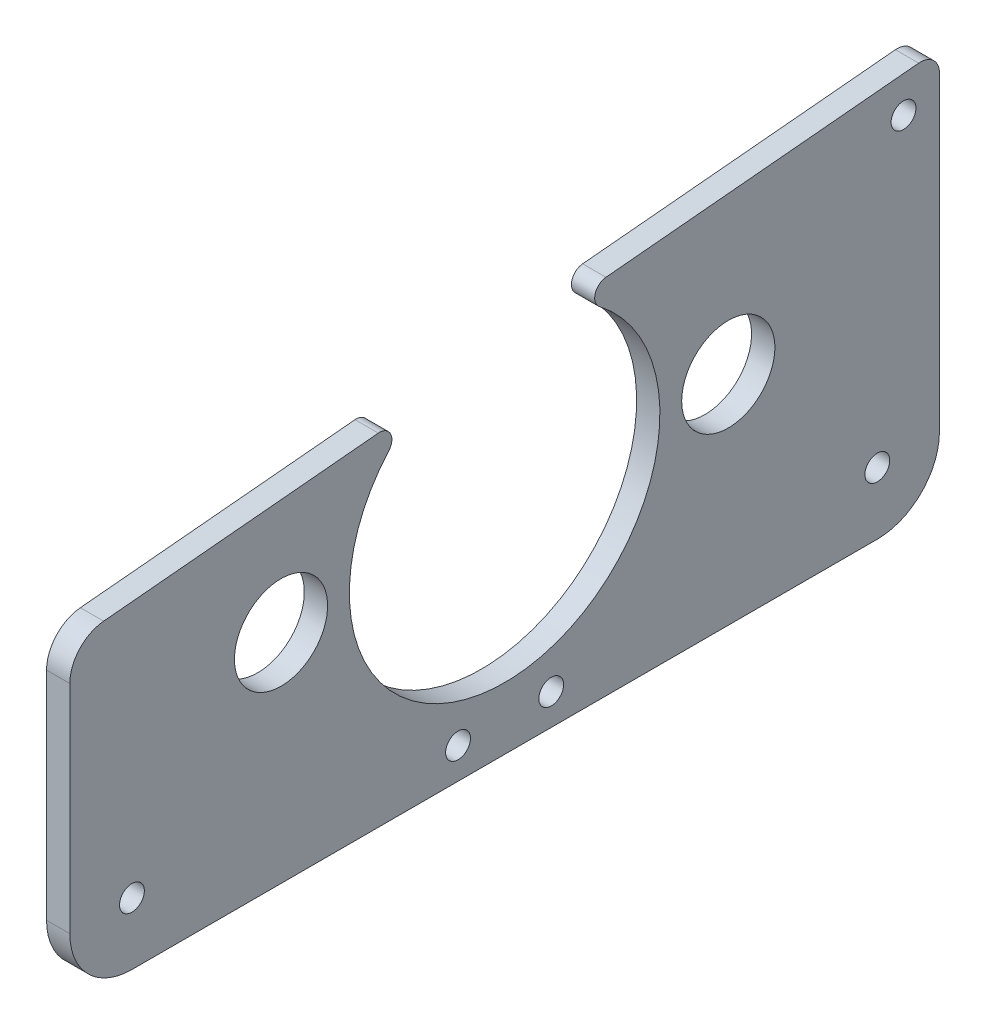
ISO-10303-21;
HEADER;
FILE_DESCRIPTION(('STEP AP214'),'2;1');
FILE_NAME('part.step','',(''),(''),'','','');
FILE_SCHEMA(('AUTOMOTIVE_DESIGN { 1 0 10303 214 1 1 1 1 }'));
ENDSEC;
DATA;
#1=APPLICATION_CONTEXT('core data for automotive mechanical design processes');
#2=APPLICATION_PROTOCOL_DEFINITION('international standard','automotive_design',2000,#1);
#3=PRODUCT_CONTEXT('',#1,'mechanical');
#4=PRODUCT('Part','Part','',(#3));
#5=PRODUCT_RELATED_PRODUCT_CATEGORY('part','',(#4));
#6=PRODUCT_DEFINITION_FORMATION('','',#4);
#7=PRODUCT_DEFINITION_CONTEXT('part definition',#1,'design');
#8=PRODUCT_DEFINITION('design','',#6,#7);
#9=PRODUCT_DEFINITION_SHAPE('','',#8);
#10=(LENGTH_UNIT() NAMED_UNIT(*) SI_UNIT(.MILLI.,.METRE.));
#11=(NAMED_UNIT(*) PLANE_ANGLE_UNIT() SI_UNIT($,.RADIAN.));
#12=(NAMED_UNIT(*) SI_UNIT($,.STERADIAN.) SOLID_ANGLE_UNIT());
#13=UNCERTAINTY_MEASURE_WITH_UNIT(LENGTH_MEASURE(1.E-05),#10,'distance_accuracy_value','');
#14=(GEOMETRIC_REPRESENTATION_CONTEXT(3) GLOBAL_UNCERTAINTY_ASSIGNED_CONTEXT((#13)) GLOBAL_UNIT_ASSIGNED_CONTEXT((#10,
#11,#12)) REPRESENTATION_CONTEXT('',''));
#15=CARTESIAN_POINT('',(0.,0.,0.));
#16=DIRECTION('',(0.,0.,1.));
#17=DIRECTION('',(1.,0.,0.));
#18=AXIS2_PLACEMENT_3D('',#15,#16,#17);
#19=CARTESIAN_POINT('',(4.7625,43.2742885665233,519.572478048036));
#20=DIRECTION('',(1.,0.,0.));
#21=DIRECTION('',(0.,0.,1.));
#22=AXIS2_PLACEMENT_3D('',#19,#20,#21);
#23=CYLINDRICAL_SURFACE('',#22,12.7);
#24=DIRECTION('',(1.,0.,0.));
#25=VECTOR('',#24,1.);
#26=CARTESIAN_POINT('',(4.7625,43.2742885665234,506.872478048036));
#27=LINE('',#26,#25);
#28=CARTESIAN_POINT('',(0.,43.2742885665234,506.872478048036));
#29=VERTEX_POINT('',#28);
#30=CARTESIAN_POINT('',(4.7625,43.2742885665234,506.872478048036));
#31=VERTEX_POINT('',#30);
#32=EDGE_CURVE('E251',#29,#31,#27,.T.);
#33=ORIENTED_EDGE('',*,*,#32,.T.);
#34=CARTESIAN_POINT('',(4.7625,43.2742885665233,519.572478048036));
#35=DIRECTION('',(-1.,0.,0.));
#36=DIRECTION('',(0.,0.,1.));
#37=AXIS2_PLACEMENT_3D('',#34,#35,#36);
#38=CIRCLE('',#37,12.7);
#39=CARTESIAN_POINT('',(4.7625,30.5742885665233,519.572478048036));
#40=VERTEX_POINT('',#39);
#41=EDGE_CURVE('E132',#31,#40,#38,.T.);
#42=ORIENTED_EDGE('',*,*,#41,.T.);
#43=DIRECTION('',(1.,0.,0.));
#44=VECTOR('',#43,1.);
#45=CARTESIAN_POINT('',(4.7625,30.5742885665233,519.572478048036));
#46=LINE('',#45,#44);
#47=CARTESIAN_POINT('',(0.,30.5742885665233,519.572478048036));
#48=VERTEX_POINT('',#47);
#49=EDGE_CURVE('E248',#48,#40,#46,.T.);
#50=ORIENTED_EDGE('',*,*,#49,.F.);
#51=CARTESIAN_POINT('',(0.,43.2742885665233,519.572478048036));
#52=DIRECTION('',(-1.,0.,0.));
#53=DIRECTION('',(0.,0.,1.));
#54=AXIS2_PLACEMENT_3D('',#51,#52,#53);
#55=CIRCLE('',#54,12.7);
#56=EDGE_CURVE('E219',#29,#48,#55,.T.);
#57=ORIENTED_EDGE('',*,*,#56,.F.);
#58=EDGE_LOOP('',(#33,#42,#50,#57));
#59=FACE_BOUND('',#58,.T.);
#60=ADVANCED_FACE('F37',(#59),#23,.T.);
#61=CARTESIAN_POINT('',(4.7625,30.5742885665233,671.972478048036));
#62=DIRECTION('',(0.,-1.,0.));
#63=DIRECTION('',(0.,0.,1.));
#64=AXIS2_PLACEMENT_3D('',#61,#62,#63);
#65=PLANE('',#64);
#66=ORIENTED_EDGE('',*,*,#49,.T.);
#67=DIRECTION('',(0.,0.,1.));
#68=VECTOR('',#67,1.);
#69=CARTESIAN_POINT('',(4.7625,30.5742885665233,671.972478048036));
#70=LINE('',#69,#68);
#71=CARTESIAN_POINT('',(4.7625,30.5742885665233,671.972478048036));
#72=VERTEX_POINT('',#71);
#73=EDGE_CURVE('E157',#40,#72,#70,.T.);
#74=ORIENTED_EDGE('',*,*,#73,.T.);
#75=DIRECTION('',(1.,0.,0.));
#76=VECTOR('',#75,1.);
#77=CARTESIAN_POINT('',(4.7625,30.5742885665233,671.972478048036));
#78=LINE('',#77,#76);
#79=CARTESIAN_POINT('',(0.,30.5742885665233,671.972478048036));
#80=VERTEX_POINT('',#79);
#81=EDGE_CURVE('E245',#80,#72,#78,.T.);
#82=ORIENTED_EDGE('',*,*,#81,.F.);
#83=DIRECTION('',(0.,0.,1.));
#84=VECTOR('',#83,1.);
#85=CARTESIAN_POINT('',(0.,30.5742885665233,510.75512339621));
#86=LINE('',#85,#84);
#87=EDGE_CURVE('E216',#48,#80,#86,.T.);
#88=ORIENTED_EDGE('',*,*,#87,.F.);
#89=EDGE_LOOP('',(#66,#74,#82,#88));
#90=FACE_BOUND('',#89,.T.);
#91=ADVANCED_FACE('F290',(#90),#65,.T.);
#92=CARTESIAN_POINT('',(4.7625,43.2742885665233,671.972478048036));
#93=DIRECTION('',(1.,0.,0.));
#94=DIRECTION('',(0.,0.,1.));
#95=AXIS2_PLACEMENT_3D('',#92,#93,#94);
#96=CYLINDRICAL_SURFACE('',#95,12.7);
#97=ORIENTED_EDGE('',*,*,#81,.T.);
#98=CARTESIAN_POINT('',(4.7625,43.2742885665233,671.972478048036));
#99=DIRECTION('',(-1.,0.,0.));
#100=DIRECTION('',(0.,0.,1.));
#101=AXIS2_PLACEMENT_3D('',#98,#99,#100);
#102=CIRCLE('',#101,12.7);
#103=CARTESIAN_POINT('',(4.7625,43.2742885665234,684.672478048036));
#104=VERTEX_POINT('',#103);
#105=EDGE_CURVE('E160',#72,#104,#102,.T.);
#106=ORIENTED_EDGE('',*,*,#105,.T.);
#107=DIRECTION('',(1.,0.,0.));
#108=VECTOR('',#107,1.);
#109=CARTESIAN_POINT('',(4.7625,43.2742885665234,684.672478048036));
#110=LINE('',#109,#108);
#111=CARTESIAN_POINT('',(0.,43.2742885665234,684.672478048036));
#112=VERTEX_POINT('',#111);
#113=EDGE_CURVE('E242',#112,#104,#110,.T.);
#114=ORIENTED_EDGE('',*,*,#113,.F.);
#115=CARTESIAN_POINT('',(0.,43.2742885665233,671.972478048036));
#116=DIRECTION('',(-1.,0.,0.));
#117=DIRECTION('',(0.,0.,1.));
#118=AXIS2_PLACEMENT_3D('',#115,#116,#117);
#119=CIRCLE('',#118,12.7);
#120=EDGE_CURVE('E213',#80,#112,#119,.T.);
#121=ORIENTED_EDGE('',*,*,#120,.F.);
#122=EDGE_LOOP('',(#97,#106,#114,#121));
#123=FACE_BOUND('',#122,.T.);
#124=ADVANCED_FACE('F294',(#123),#96,.T.);
#125=CARTESIAN_POINT('',(4.7625,87.5685067589977,684.672478048036));
#126=DIRECTION('',(0.,0.,1.));
#127=DIRECTION('',(0.,1.,0.));
#128=AXIS2_PLACEMENT_3D('',#125,#126,#127);
#129=PLANE('',#128);
#130=ORIENTED_EDGE('',*,*,#113,.T.);
#131=DIRECTION('',(0.,1.,0.));
#132=VECTOR('',#131,1.);
#133=CARTESIAN_POINT('',(4.7625,87.5685067589977,684.672478048036));
#134=LINE('',#133,#132);
#135=CARTESIAN_POINT('',(4.7625,87.5685067589977,684.672478048036));
#136=VERTEX_POINT('',#135);
#137=EDGE_CURVE('E163',#104,#136,#134,.T.);
#138=ORIENTED_EDGE('',*,*,#137,.T.);
#139=DIRECTION('',(1.,0.,0.));
#140=VECTOR('',#139,1.);
#141=CARTESIAN_POINT('',(4.7625,87.5685067589977,684.672478048036));
#142=LINE('',#141,#140);
#143=CARTESIAN_POINT('',(0.,87.5685067589977,684.672478048036));
#144=VERTEX_POINT('',#143);
#145=EDGE_CURVE('E239',#144,#136,#142,.T.);
#146=ORIENTED_EDGE('',*,*,#145,.F.);
#147=DIRECTION('',(0.,1.,0.));
#148=VECTOR('',#147,1.);
#149=CARTESIAN_POINT('',(0.,106.774288566523,684.672478048036));
#150=LINE('',#149,#148);
#151=EDGE_CURVE('E210',#112,#144,#150,.T.);
#152=ORIENTED_EDGE('',*,*,#151,.F.);
#153=EDGE_LOOP('',(#130,#138,#146,#152));
#154=FACE_BOUND('',#153,.T.);
#155=ADVANCED_FACE('F296',(#154),#129,.T.);
#156=CARTESIAN_POINT('',(4.7625,87.5685067589978,677.052478048036));
#157=DIRECTION('',(1.,0.,0.));
#158=DIRECTION('',(0.,0.,1.));
#159=AXIS2_PLACEMENT_3D('',#156,#157,#158);
#160=CYLINDRICAL_SURFACE('',#159,7.61999999999997);
#161=ORIENTED_EDGE('',*,*,#145,.T.);
#162=CARTESIAN_POINT('',(4.7625,87.5685067589978,677.052478048036));
#163=DIRECTION('',(-1.,0.,0.));
#164=DIRECTION('',(0.,0.,1.));
#165=AXIS2_PLACEMENT_3D('',#162,#163,#164);
#166=CIRCLE('',#165,7.61999999999997);
#167=CARTESIAN_POINT('',(4.7625,95.1558223329558,677.757490375002));
#168=VERTEX_POINT('',#167);
#169=EDGE_CURVE('E166',#136,#168,#166,.T.);
#170=ORIENTED_EDGE('',*,*,#169,.T.);
#171=DIRECTION('',(1.,0.,0.));
#172=VECTOR('',#171,1.);
#173=CARTESIAN_POINT('',(4.7625,95.1558223329558,677.757490375002));
#174=LINE('',#173,#172);
#175=CARTESIAN_POINT('',(0.,95.1558223329558,677.757490375002));
#176=VERTEX_POINT('',#175);
#177=EDGE_CURVE('E236',#176,#168,#174,.T.);
#178=ORIENTED_EDGE('',*,*,#177,.F.);
#179=CARTESIAN_POINT('',(0.,87.5685067589978,677.052478048036));
#180=DIRECTION('',(-1.,0.,0.));
#181=DIRECTION('',(0.,0.,1.));
#182=AXIS2_PLACEMENT_3D('',#179,#180,#181);
#183=CIRCLE('',#182,7.61999999999997);
#184=EDGE_CURVE('E207',#144,#176,#183,.T.);
#185=ORIENTED_EDGE('',*,*,#184,.F.);
#186=EDGE_LOOP('',(#161,#170,#178,#185));
#187=FACE_BOUND('',#186,.T.);
#188=ADVANCED_FACE('F277',(#187),#160,.T.);
#189=CARTESIAN_POINT('',(4.7625,101.089266083528,613.901996713408));
#190=DIRECTION('',(0.,0.995710705243837,0.0925213027514315));
#191=DIRECTION('',(0.,0.0925213027514315,-0.995710705243836));
#192=AXIS2_PLACEMENT_3D('',#189,#190,#191);
#193=PLANE('',#192);
#194=DIRECTION('',(0.,0.0925213027514315,-0.995710705243836));
#195=VECTOR('',#194,1.);
#196=CARTESIAN_POINT('',(0.,101.089266083528,613.901996713408));
#197=LINE('',#196,#195);
#198=CARTESIAN_POINT('',(0.,100.373872689405,621.601032933228));
#199=VERTEX_POINT('',#198);
#200=EDGE_CURVE('E204',#176,#199,#197,.T.);
#201=ORIENTED_EDGE('',*,*,#200,.F.);
#202=ORIENTED_EDGE('',*,*,#177,.T.);
#203=DIRECTION('',(0.,0.0925213027514315,-0.995710705243836));
#204=VECTOR('',#203,1.);
#205=CARTESIAN_POINT('',(4.7625,101.089266083528,613.901996713408));
#206=LINE('',#205,#204);
#207=CARTESIAN_POINT('',(4.7625,100.373872689405,621.601032933228));
#208=VERTEX_POINT('',#207);
#209=EDGE_CURVE('E169',#168,#208,#206,.T.);
#210=ORIENTED_EDGE('',*,*,#209,.T.);
#211=DIRECTION('',(-1.,0.,0.));
#212=VECTOR('',#211,1.);
#213=CARTESIAN_POINT('',(4.7625,100.373872689405,621.601032933228));
#214=LINE('',#213,#212);
#215=EDGE_CURVE('E252',#199,#208,#214,.F.);
#216=ORIENTED_EDGE('',*,*,#215,.F.);
#217=EDGE_LOOP('',(#201,#202,#210,#216));
#218=FACE_BOUND('',#217,.T.);
#219=ADVANCED_FACE('F271',(#218),#193,.T.);
#220=CARTESIAN_POINT('',(4.7625,75.0242885665233,595.772478048036));
#221=DIRECTION('',(-1.,0.,0.));
#222=DIRECTION('',(0.,0.,-1.));
#223=AXIS2_PLACEMENT_3D('',#220,#221,#222);
#224=CYLINDRICAL_SURFACE('',#223,31.7499999999999);
#225=CARTESIAN_POINT('',(4.7625,75.0242885665233,595.772478048036));
#226=DIRECTION('',(1.,0.,0.));
#227=DIRECTION('',(0.,0.,1.));
#228=AXIS2_PLACEMENT_3D('',#225,#226,#227);
#229=CIRCLE('',#228,31.7499999999999);
#230=CARTESIAN_POINT('',(4.7625,96.1543616513036,619.470210248224));
#231=VERTEX_POINT('',#230);
#232=CARTESIAN_POINT('',(4.7625,100.15888787566,576.373652888528));
#233=VERTEX_POINT('',#232);
#234=EDGE_CURVE('E172',#231,#233,#229,.T.);
#235=ORIENTED_EDGE('',*,*,#234,.T.);
#236=DIRECTION('',(-1.,0.,0.));
#237=VECTOR('',#236,1.);
#238=CARTESIAN_POINT('',(4.7625,100.15888787566,576.373652888528));
#239=LINE('',#238,#237);
#240=CARTESIAN_POINT('',(0.,100.15888787566,576.373652888528));
#241=VERTEX_POINT('',#240);
#242=EDGE_CURVE('E260',#241,#233,#239,.F.);
#243=ORIENTED_EDGE('',*,*,#242,.F.);
#244=CARTESIAN_POINT('',(0.,75.0242885665233,595.772478048036));
#245=DIRECTION('',(1.,0.,0.));
#246=DIRECTION('',(0.,0.,-1.));
#247=AXIS2_PLACEMENT_3D('',#244,#245,#246);
#248=CIRCLE('',#247,31.7499999999999);
#249=CARTESIAN_POINT('',(0.,96.1543616513036,619.470210248224));
#250=VERTEX_POINT('',#249);
#251=EDGE_CURVE('E202',#250,#241,#248,.T.);
#252=ORIENTED_EDGE('',*,*,#251,.F.);
#253=DIRECTION('',(-1.,0.,0.));
#254=VECTOR('',#253,1.);
#255=CARTESIAN_POINT('',(4.7625,96.1543616513036,619.470210248224));
#256=LINE('',#255,#254);
#257=EDGE_CURVE('E262',#231,#250,#256,.T.);
#258=ORIENTED_EDGE('',*,*,#257,.F.);
#259=EDGE_LOOP('',(#235,#243,#252,#258));
#260=FACE_BOUND('',#259,.T.);
#261=ADVANCED_FACE('F280',(#260),#224,.F.);
#262=CARTESIAN_POINT('',(4.7625,110.640280104365,511.114350801944));
#263=DIRECTION('',(0.,0.995710705243837,0.0925213027514315));
#264=DIRECTION('',(0.,0.0925213027514315,-0.995710705243836));
#265=AXIS2_PLACEMENT_3D('',#262,#263,#264);
#266=PLANE('',#265);
#267=DIRECTION('',(0.,0.0925213027514315,-0.995710705243836));
#268=VECTOR('',#267,1.);
#269=CARTESIAN_POINT('',(4.7625,110.640280104365,511.114350801944));
#270=LINE('',#269,#268);
#271=CARTESIAN_POINT('',(4.7625,104.69876101171,575.056750984756));
#272=VERTEX_POINT('',#271);
#273=CARTESIAN_POINT('',(4.7625,110.640280104365,511.114350801944));
#274=VERTEX_POINT('',#273);
#275=EDGE_CURVE('E175',#272,#274,#270,.T.);
#276=ORIENTED_EDGE('',*,*,#275,.T.);
#277=DIRECTION('',(1.,0.,0.));
#278=VECTOR('',#277,1.);
#279=CARTESIAN_POINT('',(4.7625,110.640280104365,511.114350801944));
#280=LINE('',#279,#278);
#281=CARTESIAN_POINT('',(0.,110.640280104365,511.114350801944));
#282=VERTEX_POINT('',#281);
#283=EDGE_CURVE('E143',#282,#274,#280,.T.);
#284=ORIENTED_EDGE('',*,*,#283,.F.);
#285=DIRECTION('',(0.,0.0925213027514315,-0.995710705243836));
#286=VECTOR('',#285,1.);
#287=CARTESIAN_POINT('',(0.,110.640280104365,511.114350801944));
#288=LINE('',#287,#286);
#289=CARTESIAN_POINT('',(0.,104.69876101171,575.056750984756));
#290=VERTEX_POINT('',#289);
#291=EDGE_CURVE('E199',#290,#282,#288,.T.);
#292=ORIENTED_EDGE('',*,*,#291,.F.);
#293=DIRECTION('',(-1.,0.,0.));
#294=VECTOR('',#293,1.);
#295=CARTESIAN_POINT('',(4.7625,104.69876101171,575.056750984756));
#296=LINE('',#295,#294);
#297=EDGE_CURVE('E11',#272,#290,#296,.T.);
#298=ORIENTED_EDGE('',*,*,#297,.F.);
#299=EDGE_LOOP('',(#276,#284,#292,#298));
#300=FACE_BOUND('',#299,.T.);
#301=ADVANCED_FACE('F285',(#300),#266,.T.);
#302=CARTESIAN_POINT('',(4.7625,106.774288566523,510.75512339621));
#303=DIRECTION('',(1.,0.,0.));
#304=DIRECTION('',(0.,0.,1.));
#305=AXIS2_PLACEMENT_3D('',#302,#303,#304);
#306=CYLINDRICAL_SURFACE('',#305,3.8826453481733);
#307=ORIENTED_EDGE('',*,*,#283,.T.);
#308=CARTESIAN_POINT('',(4.7625,106.774288566523,510.75512339621));
#309=DIRECTION('',(-1.,0.,0.));
#310=DIRECTION('',(0.,0.,1.));
#311=AXIS2_PLACEMENT_3D('',#308,#309,#310);
#312=CIRCLE('',#311,3.8826453481733);
#313=CARTESIAN_POINT('',(4.7625,106.774288566523,506.872478048036));
#314=VERTEX_POINT('',#313);
#315=EDGE_CURVE('E129',#274,#314,#312,.T.);
#316=ORIENTED_EDGE('',*,*,#315,.T.);
#317=DIRECTION('',(1.,0.,0.));
#318=VECTOR('',#317,1.);
#319=CARTESIAN_POINT('',(4.7625,106.774288566523,506.872478048036));
#320=LINE('',#319,#318);
#321=CARTESIAN_POINT('',(0.,106.774288566523,506.872478048036));
#322=VERTEX_POINT('',#321);
#323=EDGE_CURVE('E138',#322,#314,#320,.T.);
#324=ORIENTED_EDGE('',*,*,#323,.F.);
#325=CARTESIAN_POINT('',(0.,106.774288566523,510.75512339621));
#326=DIRECTION('',(-1.,0.,0.));
#327=DIRECTION('',(0.,0.,1.));
#328=AXIS2_PLACEMENT_3D('',#325,#326,#327);
#329=CIRCLE('',#328,3.8826453481733);
#330=EDGE_CURVE('E197',#282,#322,#329,.T.);
#331=ORIENTED_EDGE('',*,*,#330,.F.);
#332=EDGE_LOOP('',(#307,#316,#324,#331));
#333=FACE_BOUND('',#332,.T.);
#334=ADVANCED_FACE('F146',(#333),#306,.T.);
#335=CARTESIAN_POINT('',(4.7625,43.2742885665233,519.572478048036));
#336=DIRECTION('',(1.,0.,0.));
#337=DIRECTION('',(0.,0.,1.));
#338=AXIS2_PLACEMENT_3D('',#335,#336,#337);
#339=CYLINDRICAL_SURFACE('',#338,2.53999999999995);
#340=CARTESIAN_POINT('',(4.7625,43.2742885665233,519.572478048036));
#341=DIRECTION('',(-1.,0.,0.));
#342=DIRECTION('',(0.,0.,1.));
#343=AXIS2_PLACEMENT_3D('',#340,#341,#342);
#344=CIRCLE('',#343,2.53999999999995);
#345=CARTESIAN_POINT('',(4.7625,43.2742885665233,522.112478048036));
#346=VERTEX_POINT('',#345);
#347=EDGE_CURVE('E234',#346,#346,#344,.T.);
#348=ORIENTED_EDGE('',*,*,#347,.F.);
#349=EDGE_LOOP('',(#348));
#350=FACE_BOUND('',#349,.T.);
#351=CARTESIAN_POINT('',(0.,43.2742885665233,519.572478048036));
#352=DIRECTION('',(-1.,0.,0.));
#353=DIRECTION('',(0.,0.,1.));
#354=AXIS2_PLACEMENT_3D('',#351,#352,#353);
#355=CIRCLE('',#354,2.53999999999995);
#356=CARTESIAN_POINT('',(0.,43.2742885665233,522.112478048036));
#357=VERTEX_POINT('',#356);
#358=EDGE_CURVE('E188',#357,#357,#355,.T.);
#359=ORIENTED_EDGE('',*,*,#358,.T.);
#360=EDGE_LOOP('',(#359));
#361=FACE_BOUND('',#360,.T.);
#362=ADVANCED_FACE('F345',(#350,#361),#339,.F.);
#363=CARTESIAN_POINT('',(4.7625,36.9242885665233,605.297478048037));
#364=DIRECTION('',(1.,0.,0.));
#365=DIRECTION('',(0.,0.,1.));
#366=AXIS2_PLACEMENT_3D('',#363,#364,#365);
#367=CYLINDRICAL_SURFACE('',#366,2.53999999999995);
#368=CARTESIAN_POINT('',(4.7625,36.9242885665233,605.297478048037));
#369=DIRECTION('',(-1.,0.,0.));
#370=DIRECTION('',(0.,0.,1.));
#371=AXIS2_PLACEMENT_3D('',#368,#369,#370);
#372=CIRCLE('',#371,2.53999999999995);
#373=CARTESIAN_POINT('',(4.7625,36.9242885665233,607.837478048037));
#374=VERTEX_POINT('',#373);
#375=EDGE_CURVE('E152',#374,#374,#372,.T.);
#376=ORIENTED_EDGE('',*,*,#375,.F.);
#377=EDGE_LOOP('',(#376));
#378=FACE_BOUND('',#377,.T.);
#379=CARTESIAN_POINT('',(0.,36.9242885665233,605.297478048037));
#380=DIRECTION('',(-1.,0.,0.));
#381=DIRECTION('',(0.,0.,1.));
#382=AXIS2_PLACEMENT_3D('',#379,#380,#381);
#383=CIRCLE('',#382,2.53999999999995);
#384=CARTESIAN_POINT('',(0.,36.9242885665233,607.837478048037));
#385=VERTEX_POINT('',#384);
#386=EDGE_CURVE('E191',#385,#385,#383,.T.);
#387=ORIENTED_EDGE('',*,*,#386,.T.);
#388=EDGE_LOOP('',(#387));
#389=FACE_BOUND('',#388,.T.);
#390=ADVANCED_FACE('F348',(#378,#389),#367,.F.);
#391=CARTESIAN_POINT('',(4.7625,75.0242885665233,550.052478048036));
#392=DIRECTION('',(1.,0.,0.));
#393=DIRECTION('',(0.,0.,1.));
#394=AXIS2_PLACEMENT_3D('',#391,#392,#393);
#395=CYLINDRICAL_SURFACE('',#394,9.52500000000002);
#396=CARTESIAN_POINT('',(4.7625,75.0242885665233,550.052478048036));
#397=DIRECTION('',(-1.,0.,0.));
#398=DIRECTION('',(0.,0.,1.));
#399=AXIS2_PLACEMENT_3D('',#396,#397,#398);
#400=CIRCLE('',#399,9.52500000000002);
#401=CARTESIAN_POINT('',(4.7625,75.0242885665233,559.577478048036));
#402=VERTEX_POINT('',#401);
#403=EDGE_CURVE('E149',#402,#402,#400,.T.);
#404=ORIENTED_EDGE('',*,*,#403,.F.);
#405=EDGE_LOOP('',(#404));
#406=FACE_BOUND('',#405,.T.);
#407=CARTESIAN_POINT('',(0.,75.0242885665233,550.052478048036));
#408=DIRECTION('',(-1.,0.,0.));
#409=DIRECTION('',(0.,0.,1.));
#410=AXIS2_PLACEMENT_3D('',#407,#408,#409);
#411=CIRCLE('',#410,9.52500000000002);
#412=CARTESIAN_POINT('',(0.,75.0242885665233,559.577478048036));
#413=VERTEX_POINT('',#412);
#414=EDGE_CURVE('E194',#413,#413,#411,.T.);
#415=ORIENTED_EDGE('',*,*,#414,.T.);
#416=EDGE_LOOP('',(#415));
#417=FACE_BOUND('',#416,.T.);
#418=ADVANCED_FACE('F315',(#406,#417),#395,.F.);
#419=CARTESIAN_POINT('',(4.7625,43.2742885665234,506.872478048036));
#420=DIRECTION('',(0.,0.,-1.));
#421=DIRECTION('',(0.,-1.,0.));
#422=AXIS2_PLACEMENT_3D('',#419,#420,#421);
#423=PLANE('',#422);
#424=DIRECTION('',(0.,1.,0.));
#425=VECTOR('',#424,1.);
#426=CARTESIAN_POINT('',(0.,106.774288566523,506.872478048036));
#427=LINE('',#426,#425);
#428=EDGE_CURVE('E140',#322,#29,#427,.F.);
#429=ORIENTED_EDGE('',*,*,#428,.F.);
#430=ORIENTED_EDGE('',*,*,#323,.T.);
#431=DIRECTION('',(0.,-1.,0.));
#432=VECTOR('',#431,1.);
#433=CARTESIAN_POINT('',(4.7625,43.2742885665234,506.872478048036));
#434=LINE('',#433,#432);
#435=EDGE_CURVE('E123',#314,#31,#434,.T.);
#436=ORIENTED_EDGE('',*,*,#435,.T.);
#437=ORIENTED_EDGE('',*,*,#32,.F.);
#438=EDGE_LOOP('',(#429,#430,#436,#437));
#439=FACE_BOUND('',#438,.T.);
#440=ADVANCED_FACE('F139',(#439),#423,.T.);
#441=CARTESIAN_POINT('',(4.7625,102.974522609859,514.218184144722));
#442=DIRECTION('',(1.,0.,0.));
#443=DIRECTION('',(0.,0.,1.));
#444=AXIS2_PLACEMENT_3D('',#441,#442,#443);
#445=CYLINDRICAL_SURFACE('',#444,2.53999999999995);
#446=CARTESIAN_POINT('',(4.7625,102.974522609859,514.218184144722));
#447=DIRECTION('',(-1.,0.,0.));
#448=DIRECTION('',(0.,0.,1.));
#449=AXIS2_PLACEMENT_3D('',#446,#447,#448);
#450=CIRCLE('',#449,2.53999999999995);
#451=CARTESIAN_POINT('',(4.7625,102.974522609859,516.758184144722));
#452=VERTEX_POINT('',#451);
#453=EDGE_CURVE('E177',#452,#452,#450,.T.);
#454=ORIENTED_EDGE('',*,*,#453,.F.);
#455=EDGE_LOOP('',(#454));
#456=FACE_BOUND('',#455,.T.);
#457=CARTESIAN_POINT('',(0.,102.974522609859,514.218184144722));
#458=DIRECTION('',(-1.,0.,0.));
#459=DIRECTION('',(0.,0.,1.));
#460=AXIS2_PLACEMENT_3D('',#457,#458,#459);
#461=CIRCLE('',#460,2.53999999999995);
#462=CARTESIAN_POINT('',(0.,102.974522609859,516.758184144722));
#463=VERTEX_POINT('',#462);
#464=EDGE_CURVE('E201',#463,#463,#461,.T.);
#465=ORIENTED_EDGE('',*,*,#464,.T.);
#466=EDGE_LOOP('',(#465));
#467=FACE_BOUND('',#466,.T.);
#468=ADVANCED_FACE('F314',(#456,#467),#445,.F.);
#469=CARTESIAN_POINT('',(4.7625,75.0242885665233,641.492478048036));
#470=DIRECTION('',(1.,0.,0.));
#471=DIRECTION('',(0.,0.,1.));
#472=AXIS2_PLACEMENT_3D('',#469,#470,#471);
#473=CYLINDRICAL_SURFACE('',#472,9.52500000000002);
#474=CARTESIAN_POINT('',(4.7625,75.0242885665233,641.492478048036));
#475=DIRECTION('',(-1.,0.,0.));
#476=DIRECTION('',(0.,0.,1.));
#477=AXIS2_PLACEMENT_3D('',#474,#475,#476);
#478=CIRCLE('',#477,9.52500000000002);
#479=CARTESIAN_POINT('',(4.7625,75.0242885665233,651.017478048036));
#480=VERTEX_POINT('',#479);
#481=EDGE_CURVE('E180',#480,#480,#478,.T.);
#482=ORIENTED_EDGE('',*,*,#481,.F.);
#483=EDGE_LOOP('',(#482));
#484=FACE_BOUND('',#483,.T.);
#485=CARTESIAN_POINT('',(0.,75.0242885665233,641.492478048036));
#486=DIRECTION('',(-1.,0.,0.));
#487=DIRECTION('',(0.,0.,1.));
#488=AXIS2_PLACEMENT_3D('',#485,#486,#487);
#489=CIRCLE('',#488,9.52500000000002);
#490=CARTESIAN_POINT('',(0.,75.0242885665233,651.017478048036));
#491=VERTEX_POINT('',#490);
#492=EDGE_CURVE('E225',#491,#491,#489,.T.);
#493=ORIENTED_EDGE('',*,*,#492,.T.);
#494=EDGE_LOOP('',(#493));
#495=FACE_BOUND('',#494,.T.);
#496=ADVANCED_FACE('F318',(#484,#495),#473,.F.);
#497=CARTESIAN_POINT('',(4.7625,36.9242885665233,586.247478048036));
#498=DIRECTION('',(1.,0.,0.));
#499=DIRECTION('',(0.,0.,1.));
#500=AXIS2_PLACEMENT_3D('',#497,#498,#499);
#501=CYLINDRICAL_SURFACE('',#500,2.53999999999995);
#502=CARTESIAN_POINT('',(4.7625,36.9242885665233,586.247478048036));
#503=DIRECTION('',(-1.,0.,0.));
#504=DIRECTION('',(0.,0.,1.));
#505=AXIS2_PLACEMENT_3D('',#502,#503,#504);
#506=CIRCLE('',#505,2.53999999999995);
#507=CARTESIAN_POINT('',(4.7625,36.9242885665233,588.787478048036));
#508=VERTEX_POINT('',#507);
#509=EDGE_CURVE('E183',#508,#508,#506,.T.);
#510=ORIENTED_EDGE('',*,*,#509,.F.);
#511=EDGE_LOOP('',(#510));
#512=FACE_BOUND('',#511,.T.);
#513=CARTESIAN_POINT('',(0.,36.9242885665233,586.247478048036));
#514=DIRECTION('',(-1.,0.,0.));
#515=DIRECTION('',(0.,0.,1.));
#516=AXIS2_PLACEMENT_3D('',#513,#514,#515);
#517=CIRCLE('',#516,2.53999999999995);
#518=CARTESIAN_POINT('',(0.,36.9242885665233,588.787478048036));
#519=VERTEX_POINT('',#518);
#520=EDGE_CURVE('E228',#519,#519,#517,.T.);
#521=ORIENTED_EDGE('',*,*,#520,.T.);
#522=EDGE_LOOP('',(#521));
#523=FACE_BOUND('',#522,.T.);
#524=ADVANCED_FACE('F322',(#512,#523),#501,.F.);
#525=CARTESIAN_POINT('',(4.7625,43.2742885665233,671.972478048036));
#526=DIRECTION('',(1.,0.,0.));
#527=DIRECTION('',(0.,0.,1.));
#528=AXIS2_PLACEMENT_3D('',#525,#526,#527);
#529=CYLINDRICAL_SURFACE('',#528,2.53999999999995);
#530=CARTESIAN_POINT('',(4.7625,43.2742885665233,671.972478048036));
#531=DIRECTION('',(-1.,0.,0.));
#532=DIRECTION('',(0.,0.,1.));
#533=AXIS2_PLACEMENT_3D('',#530,#531,#532);
#534=CIRCLE('',#533,2.53999999999995);
#535=CARTESIAN_POINT('',(4.7625,43.2742885665233,674.512478048036));
#536=VERTEX_POINT('',#535);
#537=EDGE_CURVE('E144',#536,#536,#534,.T.);
#538=ORIENTED_EDGE('',*,*,#537,.F.);
#539=EDGE_LOOP('',(#538));
#540=FACE_BOUND('',#539,.T.);
#541=CARTESIAN_POINT('',(0.,43.2742885665233,671.972478048036));
#542=DIRECTION('',(-1.,0.,0.));
#543=DIRECTION('',(0.,0.,1.));
#544=AXIS2_PLACEMENT_3D('',#541,#542,#543);
#545=CIRCLE('',#544,2.53999999999995);
#546=CARTESIAN_POINT('',(0.,43.2742885665233,674.512478048036));
#547=VERTEX_POINT('',#546);
#548=EDGE_CURVE('E231',#547,#547,#545,.T.);
#549=ORIENTED_EDGE('',*,*,#548,.T.);
#550=EDGE_LOOP('',(#549));
#551=FACE_BOUND('',#550,.T.);
#552=ADVANCED_FACE('F326',(#540,#551),#529,.F.);
#553=CARTESIAN_POINT('',(4.7625,106.774288566523,510.75512339621));
#554=DIRECTION('',(1.,0.,0.));
#555=DIRECTION('',(0.,0.,1.));
#556=AXIS2_PLACEMENT_3D('',#553,#554,#555);
#557=PLANE('',#556);
#558=ORIENTED_EDGE('',*,*,#347,.T.);
#559=EDGE_LOOP('',(#558));
#560=FACE_BOUND('',#559,.T.);
#561=ORIENTED_EDGE('',*,*,#375,.T.);
#562=EDGE_LOOP('',(#561));
#563=FACE_BOUND('',#562,.T.);
#564=ORIENTED_EDGE('',*,*,#403,.T.);
#565=EDGE_LOOP('',(#564));
#566=FACE_BOUND('',#565,.T.);
#567=ORIENTED_EDGE('',*,*,#209,.F.);
#568=ORIENTED_EDGE('',*,*,#169,.F.);
#569=ORIENTED_EDGE('',*,*,#137,.F.);
#570=ORIENTED_EDGE('',*,*,#105,.F.);
#571=ORIENTED_EDGE('',*,*,#73,.F.);
#572=ORIENTED_EDGE('',*,*,#41,.F.);
#573=ORIENTED_EDGE('',*,*,#435,.F.);
#574=ORIENTED_EDGE('',*,*,#315,.F.);
#575=ORIENTED_EDGE('',*,*,#275,.F.);
#576=CARTESIAN_POINT('',(4.7625,102.16965582039,574.821746875768));
#577=DIRECTION('',(-1.,0.,0.));
#578=DIRECTION('',(0.,0.,1.));
#579=AXIS2_PLACEMENT_3D('',#576,#577,#578);
#580=CIRCLE('',#579,2.54);
#581=EDGE_CURVE('E256',#233,#272,#580,.T.);
#582=ORIENTED_EDGE('',*,*,#581,.F.);
#583=ORIENTED_EDGE('',*,*,#234,.F.);
#584=CARTESIAN_POINT('',(4.7625,97.844767498086,621.366028824239));
#585=DIRECTION('',(-1.,0.,0.));
#586=DIRECTION('',(0.,0.,1.));
#587=AXIS2_PLACEMENT_3D('',#584,#585,#586);
#588=CIRCLE('',#587,2.54);
#589=EDGE_CURVE('E258',#208,#231,#588,.T.);
#590=ORIENTED_EDGE('',*,*,#589,.F.);
#591=EDGE_LOOP('',(#567,#568,#569,#570,#571,#572,#573,#574,#575,#582,#583,#590));
#592=FACE_BOUND('',#591,.T.);
#593=ORIENTED_EDGE('',*,*,#453,.T.);
#594=EDGE_LOOP('',(#593));
#595=FACE_BOUND('',#594,.T.);
#596=ORIENTED_EDGE('',*,*,#481,.T.);
#597=EDGE_LOOP('',(#596));
#598=FACE_BOUND('',#597,.T.);
#599=ORIENTED_EDGE('',*,*,#509,.T.);
#600=EDGE_LOOP('',(#599));
#601=FACE_BOUND('',#600,.T.);
#602=ORIENTED_EDGE('',*,*,#537,.T.);
#603=EDGE_LOOP('',(#602));
#604=FACE_BOUND('',#603,.T.);
#605=ADVANCED_FACE('F125',(#560,#563,#566,#592,#595,#598,#601,#604),#557,.T.);
#606=CARTESIAN_POINT('',(0.,106.774288566523,510.75512339621));
#607=DIRECTION('',(1.,0.,0.));
#608=DIRECTION('',(0.,0.,1.));
#609=AXIS2_PLACEMENT_3D('',#606,#607,#608);
#610=PLANE('',#609);
#611=ORIENTED_EDGE('',*,*,#358,.F.);
#612=EDGE_LOOP('',(#611));
#613=FACE_BOUND('',#612,.T.);
#614=ORIENTED_EDGE('',*,*,#386,.F.);
#615=EDGE_LOOP('',(#614));
#616=FACE_BOUND('',#615,.T.);
#617=ORIENTED_EDGE('',*,*,#414,.F.);
#618=EDGE_LOOP('',(#617));
#619=FACE_BOUND('',#618,.T.);
#620=ORIENTED_EDGE('',*,*,#251,.T.);
#621=CARTESIAN_POINT('',(0.,102.16965582039,574.821746875768));
#622=DIRECTION('',(-1.,0.,0.));
#623=DIRECTION('',(0.,0.,1.));
#624=AXIS2_PLACEMENT_3D('',#621,#622,#623);
#625=CIRCLE('',#624,2.54);
#626=EDGE_CURVE('E52',#290,#241,#625,.F.);
#627=ORIENTED_EDGE('',*,*,#626,.F.);
#628=ORIENTED_EDGE('',*,*,#291,.T.);
#629=ORIENTED_EDGE('',*,*,#330,.T.);
#630=ORIENTED_EDGE('',*,*,#428,.T.);
#631=ORIENTED_EDGE('',*,*,#56,.T.);
#632=ORIENTED_EDGE('',*,*,#87,.T.);
#633=ORIENTED_EDGE('',*,*,#120,.T.);
#634=ORIENTED_EDGE('',*,*,#151,.T.);
#635=ORIENTED_EDGE('',*,*,#184,.T.);
#636=ORIENTED_EDGE('',*,*,#200,.T.);
#637=CARTESIAN_POINT('',(0.,97.844767498086,621.366028824239));
#638=DIRECTION('',(-1.,0.,0.));
#639=DIRECTION('',(0.,0.,1.));
#640=AXIS2_PLACEMENT_3D('',#637,#638,#639);
#641=CIRCLE('',#640,2.54);
#642=EDGE_CURVE('E45',#250,#199,#641,.F.);
#643=ORIENTED_EDGE('',*,*,#642,.F.);
#644=EDGE_LOOP('',(#620,#627,#628,#629,#630,#631,#632,#633,#634,#635,#636,#643));
#645=FACE_BOUND('',#644,.T.);
#646=ORIENTED_EDGE('',*,*,#464,.F.);
#647=EDGE_LOOP('',(#646));
#648=FACE_BOUND('',#647,.T.);
#649=ORIENTED_EDGE('',*,*,#492,.F.);
#650=EDGE_LOOP('',(#649));
#651=FACE_BOUND('',#650,.T.);
#652=ORIENTED_EDGE('',*,*,#520,.F.);
#653=EDGE_LOOP('',(#652));
#654=FACE_BOUND('',#653,.T.);
#655=ORIENTED_EDGE('',*,*,#548,.F.);
#656=EDGE_LOOP('',(#655));
#657=FACE_BOUND('',#656,.T.);
#658=ADVANCED_FACE('F272',(#613,#616,#619,#645,#648,#651,#654,#657),#610,.F.);
#659=CARTESIAN_POINT('',(4.7625,97.844767498086,621.366028824239));
#660=DIRECTION('',(-1.,0.,0.));
#661=DIRECTION('',(0.,0.,-1.));
#662=AXIS2_PLACEMENT_3D('',#659,#660,#661);
#663=CYLINDRICAL_SURFACE('',#662,2.54);
#664=ORIENTED_EDGE('',*,*,#642,.T.);
#665=ORIENTED_EDGE('',*,*,#215,.T.);
#666=ORIENTED_EDGE('',*,*,#589,.T.);
#667=ORIENTED_EDGE('',*,*,#257,.T.);
#668=EDGE_LOOP('',(#664,#665,#666,#667));
#669=FACE_BOUND('',#668,.T.);
#670=ADVANCED_FACE('F267',(#669),#663,.T.);
#671=CARTESIAN_POINT('',(4.7625,102.16965582039,574.821746875768));
#672=DIRECTION('',(-1.,0.,0.));
#673=DIRECTION('',(0.,0.,-1.));
#674=AXIS2_PLACEMENT_3D('',#671,#672,#673);
#675=CYLINDRICAL_SURFACE('',#674,2.54);
#676=ORIENTED_EDGE('',*,*,#626,.T.);
#677=ORIENTED_EDGE('',*,*,#242,.T.);
#678=ORIENTED_EDGE('',*,*,#581,.T.);
#679=ORIENTED_EDGE('',*,*,#297,.T.);
#680=EDGE_LOOP('',(#676,#677,#678,#679));
#681=FACE_BOUND('',#680,.T.);
#682=ADVANCED_FACE('F39',(#681),#675,.T.);
#683=CLOSED_SHELL('',(#60,#91,#124,#155,#188,#219,#261,#301,#334,#362,#390,#418,#440,#468,#496,
#524,#552,#605,#658,#670,#682));
#684=MANIFOLD_SOLID_BREP('B2',#683);
#685=ADVANCED_BREP_SHAPE_REPRESENTATION('',(#18,#684),#14);
#686=SHAPE_DEFINITION_REPRESENTATION(#9,#685);
ENDSEC;
END-ISO-10303-21;
